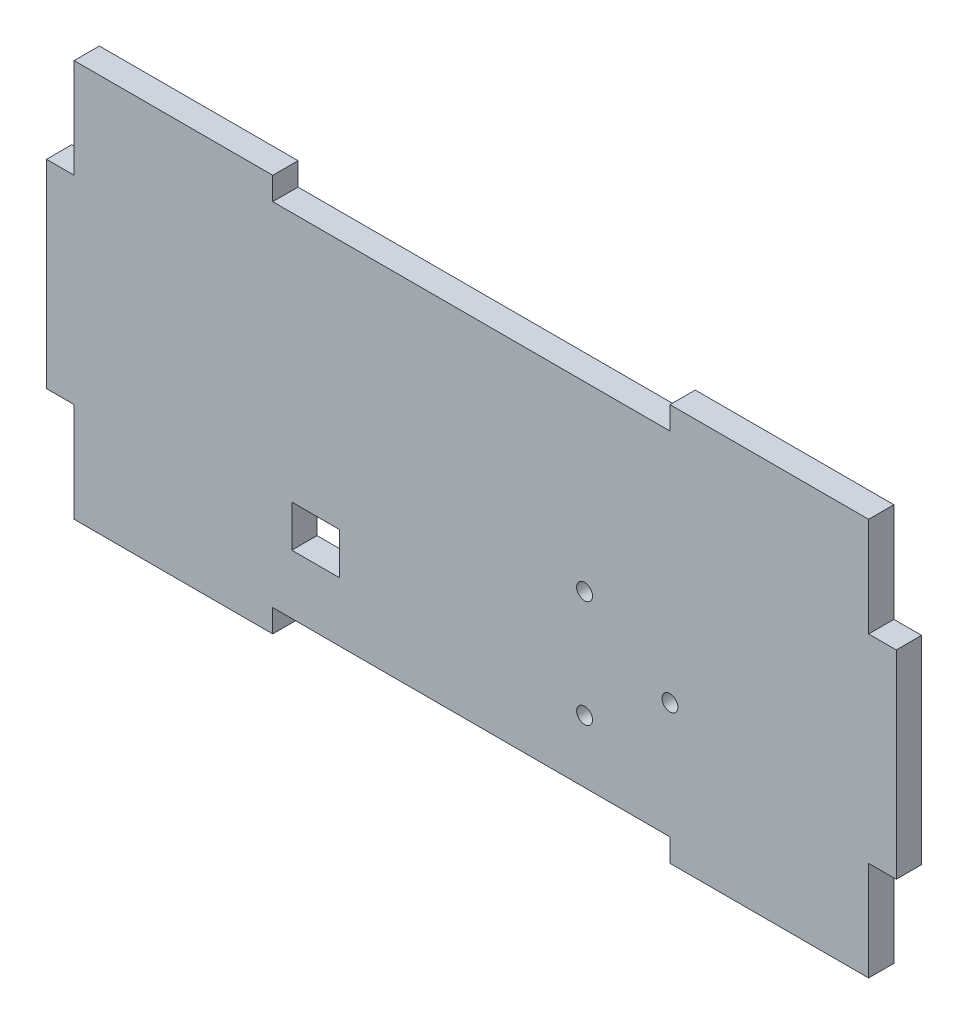
ISO-10303-21;
HEADER;
FILE_DESCRIPTION(('STEP AP214'),'2;1');
FILE_NAME('part.step','',(''),(''),'','','');
FILE_SCHEMA(('AUTOMOTIVE_DESIGN { 1 0 10303 214 1 1 1 1 }'));
ENDSEC;
DATA;
#1=APPLICATION_CONTEXT('core data for automotive mechanical design processes');
#2=APPLICATION_PROTOCOL_DEFINITION('international standard','automotive_design',2000,#1);
#3=PRODUCT_CONTEXT('',#1,'mechanical');
#4=PRODUCT('Part','Part','',(#3));
#5=PRODUCT_RELATED_PRODUCT_CATEGORY('part','',(#4));
#6=PRODUCT_DEFINITION_FORMATION('','',#4);
#7=PRODUCT_DEFINITION_CONTEXT('part definition',#1,'design');
#8=PRODUCT_DEFINITION('design','',#6,#7);
#9=PRODUCT_DEFINITION_SHAPE('','',#8);
#10=(LENGTH_UNIT() NAMED_UNIT(*) SI_UNIT(.MILLI.,.METRE.));
#11=(NAMED_UNIT(*) PLANE_ANGLE_UNIT() SI_UNIT($,.RADIAN.));
#12=(NAMED_UNIT(*) SI_UNIT($,.STERADIAN.) SOLID_ANGLE_UNIT());
#13=UNCERTAINTY_MEASURE_WITH_UNIT(LENGTH_MEASURE(1.E-05),#10,'distance_accuracy_value','');
#14=(GEOMETRIC_REPRESENTATION_CONTEXT(3) GLOBAL_UNCERTAINTY_ASSIGNED_CONTEXT((#13)) GLOBAL_UNIT_ASSIGNED_CONTEXT((#10,
#11,#12)) REPRESENTATION_CONTEXT('',''));
#15=CARTESIAN_POINT('',(0.,0.,0.));
#16=DIRECTION('',(0.,0.,1.));
#17=DIRECTION('',(1.,0.,0.));
#18=AXIS2_PLACEMENT_3D('',#15,#16,#17);
#19=CARTESIAN_POINT('',(0.,0.,6.36));
#20=DIRECTION('',(0.,0.,1.));
#21=DIRECTION('',(1.,0.,0.));
#22=AXIS2_PLACEMENT_3D('',#19,#20,#21);
#23=PLANE('',#22);
#24=CARTESIAN_POINT('',(50.,-15.,6.36));
#25=DIRECTION('',(0.,0.,1.));
#26=DIRECTION('',(1.,0.,0.));
#27=AXIS2_PLACEMENT_3D('',#24,#25,#26);
#28=CIRCLE('',#27,2.);
#29=CARTESIAN_POINT('',(52.,-15.,6.36));
#30=VERTEX_POINT('',#29);
#31=EDGE_CURVE('E236',#30,#30,#28,.T.);
#32=ORIENTED_EDGE('',*,*,#31,.F.);
#33=EDGE_LOOP('',(#32));
#34=FACE_BOUND('',#33,.T.);
#35=CARTESIAN_POINT('',(28.5,-1.50000000000001,6.36));
#36=DIRECTION('',(0.,0.,1.));
#37=DIRECTION('',(1.,0.,0.));
#38=AXIS2_PLACEMENT_3D('',#35,#36,#37);
#39=CIRCLE('',#38,2.);
#40=CARTESIAN_POINT('',(30.5,-1.50000000000001,6.36));
#41=VERTEX_POINT('',#40);
#42=EDGE_CURVE('E240',#41,#41,#39,.T.);
#43=ORIENTED_EDGE('',*,*,#42,.F.);
#44=EDGE_LOOP('',(#43));
#45=FACE_BOUND('',#44,.T.);
#46=CARTESIAN_POINT('',(28.5,-28.5,6.36));
#47=DIRECTION('',(0.,0.,1.));
#48=DIRECTION('',(-1.,0.,0.));
#49=AXIS2_PLACEMENT_3D('',#46,#47,#48);
#50=CIRCLE('',#49,2.00000000000001);
#51=CARTESIAN_POINT('',(26.5,-28.5,6.36));
#52=VERTEX_POINT('',#51);
#53=EDGE_CURVE('E232',#52,#52,#50,.T.);
#54=ORIENTED_EDGE('',*,*,#53,.F.);
#55=EDGE_LOOP('',(#54));
#56=FACE_BOUND('',#55,.T.);
#57=DIRECTION('',(1.,0.,0.));
#58=VECTOR('',#57,1.);
#59=CARTESIAN_POINT('',(-100.,-50.,6.36));
#60=LINE('',#59,#58);
#61=CARTESIAN_POINT('',(-100.,-50.,6.36));
#62=VERTEX_POINT('',#61);
#63=CARTESIAN_POINT('',(-50.,-50.,6.36));
#64=VERTEX_POINT('',#63);
#65=EDGE_CURVE('E362',#62,#64,#60,.T.);
#66=ORIENTED_EDGE('',*,*,#65,.T.);
#67=DIRECTION('',(0.,1.,0.));
#68=VECTOR('',#67,1.);
#69=CARTESIAN_POINT('',(-50.,0.,6.36));
#70=LINE('',#69,#68);
#71=CARTESIAN_POINT('',(-50.,-44.24,6.36));
#72=VERTEX_POINT('',#71);
#73=EDGE_CURVE('E269',#64,#72,#70,.T.);
#74=ORIENTED_EDGE('',*,*,#73,.T.);
#75=DIRECTION('',(1.,0.,0.));
#76=VECTOR('',#75,1.);
#77=CARTESIAN_POINT('',(0.,-44.24,6.36));
#78=LINE('',#77,#76);
#79=CARTESIAN_POINT('',(50.,-44.24,6.36));
#80=VERTEX_POINT('',#79);
#81=EDGE_CURVE('E266',#72,#80,#78,.T.);
#82=ORIENTED_EDGE('',*,*,#81,.T.);
#83=DIRECTION('',(0.,-1.,0.));
#84=VECTOR('',#83,1.);
#85=CARTESIAN_POINT('',(50.,0.,6.36));
#86=LINE('',#85,#84);
#87=CARTESIAN_POINT('',(50.,-50.,6.36));
#88=VERTEX_POINT('',#87);
#89=EDGE_CURVE('E256',#80,#88,#86,.T.);
#90=ORIENTED_EDGE('',*,*,#89,.T.);
#91=CARTESIAN_POINT('',(100.,-50.,6.36));
#92=VERTEX_POINT('',#91);
#93=EDGE_CURVE('E361',#88,#92,#60,.T.);
#94=ORIENTED_EDGE('',*,*,#93,.T.);
#95=DIRECTION('',(0.,1.,0.));
#96=VECTOR('',#95,1.);
#97=CARTESIAN_POINT('',(100.,50.,6.36));
#98=LINE('',#97,#96);
#99=CARTESIAN_POINT('',(100.,-25.,6.36));
#100=VERTEX_POINT('',#99);
#101=EDGE_CURVE('E349',#92,#100,#98,.T.);
#102=ORIENTED_EDGE('',*,*,#101,.T.);
#103=DIRECTION('',(1.,0.,0.));
#104=VECTOR('',#103,1.);
#105=CARTESIAN_POINT('',(100.,-25.,6.36));
#106=LINE('',#105,#104);
#107=CARTESIAN_POINT('',(106.96,-25.,6.36));
#108=VERTEX_POINT('',#107);
#109=EDGE_CURVE('E304',#100,#108,#106,.T.);
#110=ORIENTED_EDGE('',*,*,#109,.T.);
#111=DIRECTION('',(0.,1.,0.));
#112=VECTOR('',#111,1.);
#113=CARTESIAN_POINT('',(106.96,25.,6.36));
#114=LINE('',#113,#112);
#115=CARTESIAN_POINT('',(106.96,25.,6.36));
#116=VERTEX_POINT('',#115);
#117=EDGE_CURVE('E301',#108,#116,#114,.T.);
#118=ORIENTED_EDGE('',*,*,#117,.T.);
#119=DIRECTION('',(-1.,0.,0.));
#120=VECTOR('',#119,1.);
#121=CARTESIAN_POINT('',(100.,25.,6.36));
#122=LINE('',#121,#120);
#123=CARTESIAN_POINT('',(100.,25.,6.36));
#124=VERTEX_POINT('',#123);
#125=EDGE_CURVE('E299',#116,#124,#122,.T.);
#126=ORIENTED_EDGE('',*,*,#125,.T.);
#127=CARTESIAN_POINT('',(100.,50.,6.36));
#128=VERTEX_POINT('',#127);
#129=EDGE_CURVE('E353',#124,#128,#98,.T.);
#130=ORIENTED_EDGE('',*,*,#129,.T.);
#131=DIRECTION('',(-1.,0.,0.));
#132=VECTOR('',#131,1.);
#133=CARTESIAN_POINT('',(-100.,50.,6.36));
#134=LINE('',#133,#132);
#135=CARTESIAN_POINT('',(50.,50.,6.36));
#136=VERTEX_POINT('',#135);
#137=EDGE_CURVE('E354',#128,#136,#134,.T.);
#138=ORIENTED_EDGE('',*,*,#137,.T.);
#139=DIRECTION('',(0.,1.,0.));
#140=VECTOR('',#139,1.);
#141=CARTESIAN_POINT('',(50.,0.,6.36));
#142=LINE('',#141,#140);
#143=CARTESIAN_POINT('',(50.,44.24,6.36));
#144=VERTEX_POINT('',#143);
#145=EDGE_CURVE('E294',#144,#136,#142,.T.);
#146=ORIENTED_EDGE('',*,*,#145,.F.);
#147=DIRECTION('',(1.,0.,0.));
#148=VECTOR('',#147,1.);
#149=CARTESIAN_POINT('',(0.,44.24,6.36));
#150=LINE('',#149,#148);
#151=CARTESIAN_POINT('',(-50.,44.24,6.36));
#152=VERTEX_POINT('',#151);
#153=EDGE_CURVE('E284',#152,#144,#150,.T.);
#154=ORIENTED_EDGE('',*,*,#153,.F.);
#155=DIRECTION('',(0.,-1.,0.));
#156=VECTOR('',#155,1.);
#157=CARTESIAN_POINT('',(-50.,0.,6.36));
#158=LINE('',#157,#156);
#159=CARTESIAN_POINT('',(-50.,50.,6.36));
#160=VERTEX_POINT('',#159);
#161=EDGE_CURVE('E296',#160,#152,#158,.T.);
#162=ORIENTED_EDGE('',*,*,#161,.F.);
#163=CARTESIAN_POINT('',(-100.,50.,6.36));
#164=VERTEX_POINT('',#163);
#165=EDGE_CURVE('E352',#160,#164,#134,.T.);
#166=ORIENTED_EDGE('',*,*,#165,.T.);
#167=DIRECTION('',(0.,-1.,0.));
#168=VECTOR('',#167,1.);
#169=CARTESIAN_POINT('',(-100.,50.,6.36));
#170=LINE('',#169,#168);
#171=CARTESIAN_POINT('',(-100.,25.,6.36));
#172=VERTEX_POINT('',#171);
#173=EDGE_CURVE('E358',#164,#172,#170,.T.);
#174=ORIENTED_EDGE('',*,*,#173,.T.);
#175=DIRECTION('',(1.,0.,0.));
#176=VECTOR('',#175,1.);
#177=CARTESIAN_POINT('',(-100.,25.,6.36));
#178=LINE('',#177,#176);
#179=CARTESIAN_POINT('',(-106.96,25.,6.36));
#180=VERTEX_POINT('',#179);
#181=EDGE_CURVE('E330',#180,#172,#178,.T.);
#182=ORIENTED_EDGE('',*,*,#181,.F.);
#183=DIRECTION('',(0.,1.,0.));
#184=VECTOR('',#183,1.);
#185=CARTESIAN_POINT('',(-106.96,25.,6.36));
#186=LINE('',#185,#184);
#187=CARTESIAN_POINT('',(-106.96,-25.,6.36));
#188=VERTEX_POINT('',#187);
#189=EDGE_CURVE('E326',#188,#180,#186,.T.);
#190=ORIENTED_EDGE('',*,*,#189,.F.);
#191=DIRECTION('',(-1.,0.,0.));
#192=VECTOR('',#191,1.);
#193=CARTESIAN_POINT('',(-100.,-25.,6.36));
#194=LINE('',#193,#192);
#195=CARTESIAN_POINT('',(-100.,-25.,6.36));
#196=VERTEX_POINT('',#195);
#197=EDGE_CURVE('E323',#196,#188,#194,.T.);
#198=ORIENTED_EDGE('',*,*,#197,.F.);
#199=EDGE_CURVE('E357',#196,#62,#170,.T.);
#200=ORIENTED_EDGE('',*,*,#199,.T.);
#201=EDGE_LOOP('',(#66,#74,#82,#90,#94,#102,#110,#118,#126,#130,#138,#146,#154,#162,#166,#174,
#182,#190,#198,#200));
#202=FACE_BOUND('',#201,.T.);
#203=DIRECTION('',(-1.,0.,0.));
#204=VECTOR('',#203,1.);
#205=CARTESIAN_POINT('',(0.,-18.84,6.36));
#206=LINE('',#205,#204);
#207=CARTESIAN_POINT('',(-33.1999999999999,-18.84,6.36));
#208=VERTEX_POINT('',#207);
#209=CARTESIAN_POINT('',(-45.1999999999999,-18.84,6.36));
#210=VERTEX_POINT('',#209);
#211=EDGE_CURVE('E214',#208,#210,#206,.T.);
#212=ORIENTED_EDGE('',*,*,#211,.F.);
#213=DIRECTION('',(0.,1.,0.));
#214=VECTOR('',#213,1.);
#215=CARTESIAN_POINT('',(-33.1999999999999,0.,6.36));
#216=LINE('',#215,#214);
#217=CARTESIAN_POINT('',(-33.1999999999999,-29.34,6.36));
#218=VERTEX_POINT('',#217);
#219=EDGE_CURVE('E210',#218,#208,#216,.T.);
#220=ORIENTED_EDGE('',*,*,#219,.F.);
#221=DIRECTION('',(1.,0.,0.));
#222=VECTOR('',#221,1.);
#223=CARTESIAN_POINT('',(0.,-29.34,6.36));
#224=LINE('',#223,#222);
#225=CARTESIAN_POINT('',(-45.1999999999999,-29.34,6.36));
#226=VERTEX_POINT('',#225);
#227=EDGE_CURVE('E202',#226,#218,#224,.T.);
#228=ORIENTED_EDGE('',*,*,#227,.F.);
#229=DIRECTION('',(0.,-1.,0.));
#230=VECTOR('',#229,1.);
#231=CARTESIAN_POINT('',(-45.1999999999999,0.,6.36));
#232=LINE('',#231,#230);
#233=EDGE_CURVE('E209',#210,#226,#232,.T.);
#234=ORIENTED_EDGE('',*,*,#233,.F.);
#235=EDGE_LOOP('',(#212,#220,#228,#234));
#236=FACE_BOUND('',#235,.T.);
#237=ADVANCED_FACE('F39',(#34,#45,#56,#202,#236),#23,.T.);
#238=CARTESIAN_POINT('',(0.,0.,0.));
#239=DIRECTION('',(0.,0.,1.));
#240=DIRECTION('',(1.,0.,0.));
#241=AXIS2_PLACEMENT_3D('',#238,#239,#240);
#242=PLANE('',#241);
#243=DIRECTION('',(0.,1.,0.));
#244=VECTOR('',#243,1.);
#245=CARTESIAN_POINT('',(-50.,-50.,0.));
#246=LINE('',#245,#244);
#247=CARTESIAN_POINT('',(-50.,-50.,0.));
#248=VERTEX_POINT('',#247);
#249=CARTESIAN_POINT('',(-50.,-44.24,0.));
#250=VERTEX_POINT('',#249);
#251=EDGE_CURVE('E245',#248,#250,#246,.T.);
#252=ORIENTED_EDGE('',*,*,#251,.F.);
#253=DIRECTION('',(1.,0.,0.));
#254=VECTOR('',#253,1.);
#255=CARTESIAN_POINT('',(-100.,-50.,0.));
#256=LINE('',#255,#254);
#257=CARTESIAN_POINT('',(-100.,-50.,0.));
#258=VERTEX_POINT('',#257);
#259=EDGE_CURVE('E378',#258,#248,#256,.T.);
#260=ORIENTED_EDGE('',*,*,#259,.F.);
#261=DIRECTION('',(0.,-1.,0.));
#262=VECTOR('',#261,1.);
#263=CARTESIAN_POINT('',(-100.,50.,0.));
#264=LINE('',#263,#262);
#265=CARTESIAN_POINT('',(-100.,-25.,0.));
#266=VERTEX_POINT('',#265);
#267=EDGE_CURVE('E373',#266,#258,#264,.T.);
#268=ORIENTED_EDGE('',*,*,#267,.F.);
#269=DIRECTION('',(-1.,0.,0.));
#270=VECTOR('',#269,1.);
#271=CARTESIAN_POINT('',(-100.,-25.,0.));
#272=LINE('',#271,#270);
#273=CARTESIAN_POINT('',(-106.96,-25.,0.));
#274=VERTEX_POINT('',#273);
#275=EDGE_CURVE('E314',#266,#274,#272,.T.);
#276=ORIENTED_EDGE('',*,*,#275,.T.);
#277=DIRECTION('',(0.,1.,0.));
#278=VECTOR('',#277,1.);
#279=CARTESIAN_POINT('',(-106.96,25.,0.));
#280=LINE('',#279,#278);
#281=CARTESIAN_POINT('',(-106.96,25.,0.));
#282=VERTEX_POINT('',#281);
#283=EDGE_CURVE('E335',#274,#282,#280,.T.);
#284=ORIENTED_EDGE('',*,*,#283,.T.);
#285=DIRECTION('',(1.,0.,0.));
#286=VECTOR('',#285,1.);
#287=CARTESIAN_POINT('',(-100.,25.,0.));
#288=LINE('',#287,#286);
#289=CARTESIAN_POINT('',(-100.,25.,0.));
#290=VERTEX_POINT('',#289);
#291=EDGE_CURVE('E327',#282,#290,#288,.T.);
#292=ORIENTED_EDGE('',*,*,#291,.T.);
#293=CARTESIAN_POINT('',(-100.,50.,0.));
#294=VERTEX_POINT('',#293);
#295=EDGE_CURVE('E374',#294,#290,#264,.T.);
#296=ORIENTED_EDGE('',*,*,#295,.F.);
#297=DIRECTION('',(-1.,0.,0.));
#298=VECTOR('',#297,1.);
#299=CARTESIAN_POINT('',(-100.,50.,0.));
#300=LINE('',#299,#298);
#301=CARTESIAN_POINT('',(-50.,50.,0.));
#302=VERTEX_POINT('',#301);
#303=EDGE_CURVE('E369',#302,#294,#300,.T.);
#304=ORIENTED_EDGE('',*,*,#303,.F.);
#305=DIRECTION('',(0.,-1.,0.));
#306=VECTOR('',#305,1.);
#307=CARTESIAN_POINT('',(-50.,50.,0.));
#308=LINE('',#307,#306);
#309=CARTESIAN_POINT('',(-50.,44.24,0.));
#310=VERTEX_POINT('',#309);
#311=EDGE_CURVE('E272',#302,#310,#308,.T.);
#312=ORIENTED_EDGE('',*,*,#311,.T.);
#313=DIRECTION('',(1.,0.,0.));
#314=VECTOR('',#313,1.);
#315=CARTESIAN_POINT('',(-50.,44.24,0.));
#316=LINE('',#315,#314);
#317=CARTESIAN_POINT('',(50.,44.24,0.));
#318=VERTEX_POINT('',#317);
#319=EDGE_CURVE('E275',#310,#318,#316,.T.);
#320=ORIENTED_EDGE('',*,*,#319,.T.);
#321=DIRECTION('',(0.,1.,0.));
#322=VECTOR('',#321,1.);
#323=CARTESIAN_POINT('',(50.,50.,0.));
#324=LINE('',#323,#322);
#325=CARTESIAN_POINT('',(50.,50.,0.));
#326=VERTEX_POINT('',#325);
#327=EDGE_CURVE('E278',#318,#326,#324,.T.);
#328=ORIENTED_EDGE('',*,*,#327,.T.);
#329=CARTESIAN_POINT('',(100.,50.,0.));
#330=VERTEX_POINT('',#329);
#331=EDGE_CURVE('E370',#330,#326,#300,.T.);
#332=ORIENTED_EDGE('',*,*,#331,.F.);
#333=DIRECTION('',(0.,1.,0.));
#334=VECTOR('',#333,1.);
#335=CARTESIAN_POINT('',(100.,50.,0.));
#336=LINE('',#335,#334);
#337=CARTESIAN_POINT('',(100.,25.,0.));
#338=VERTEX_POINT('',#337);
#339=EDGE_CURVE('E342',#338,#330,#336,.T.);
#340=ORIENTED_EDGE('',*,*,#339,.F.);
#341=DIRECTION('',(-1.,0.,0.));
#342=VECTOR('',#341,1.);
#343=CARTESIAN_POINT('',(100.,25.,0.));
#344=LINE('',#343,#342);
#345=CARTESIAN_POINT('',(106.96,25.,0.));
#346=VERTEX_POINT('',#345);
#347=EDGE_CURVE('E298',#346,#338,#344,.T.);
#348=ORIENTED_EDGE('',*,*,#347,.F.);
#349=DIRECTION('',(0.,1.,0.));
#350=VECTOR('',#349,1.);
#351=CARTESIAN_POINT('',(106.96,25.,0.));
#352=LINE('',#351,#350);
#353=CARTESIAN_POINT('',(106.96,-25.,0.));
#354=VERTEX_POINT('',#353);
#355=EDGE_CURVE('E308',#354,#346,#352,.T.);
#356=ORIENTED_EDGE('',*,*,#355,.F.);
#357=DIRECTION('',(1.,0.,0.));
#358=VECTOR('',#357,1.);
#359=CARTESIAN_POINT('',(100.,-25.,0.));
#360=LINE('',#359,#358);
#361=CARTESIAN_POINT('',(100.,-25.,0.));
#362=VERTEX_POINT('',#361);
#363=EDGE_CURVE('E302',#362,#354,#360,.T.);
#364=ORIENTED_EDGE('',*,*,#363,.F.);
#365=CARTESIAN_POINT('',(100.,-50.,0.));
#366=VERTEX_POINT('',#365);
#367=EDGE_CURVE('E366',#366,#362,#336,.T.);
#368=ORIENTED_EDGE('',*,*,#367,.F.);
#369=CARTESIAN_POINT('',(50.,-50.,0.));
#370=VERTEX_POINT('',#369);
#371=EDGE_CURVE('E377',#370,#366,#256,.T.);
#372=ORIENTED_EDGE('',*,*,#371,.F.);
#373=DIRECTION('',(0.,-1.,0.));
#374=VECTOR('',#373,1.);
#375=CARTESIAN_POINT('',(50.,-50.,0.));
#376=LINE('',#375,#374);
#377=CARTESIAN_POINT('',(50.,-44.24,0.));
#378=VERTEX_POINT('',#377);
#379=EDGE_CURVE('E247',#378,#370,#376,.T.);
#380=ORIENTED_EDGE('',*,*,#379,.F.);
#381=DIRECTION('',(1.,0.,0.));
#382=VECTOR('',#381,1.);
#383=CARTESIAN_POINT('',(-50.,-44.24,0.));
#384=LINE('',#383,#382);
#385=EDGE_CURVE('E249',#250,#378,#384,.T.);
#386=ORIENTED_EDGE('',*,*,#385,.F.);
#387=EDGE_LOOP('',(#252,#260,#268,#276,#284,#292,#296,#304,#312,#320,#328,#332,#340,#348,#356,
#364,#368,#372,#380,#386));
#388=FACE_BOUND('',#387,.T.);
#389=CARTESIAN_POINT('',(28.5,-28.5,0.));
#390=DIRECTION('',(0.,0.,1.));
#391=DIRECTION('',(1.,0.,0.));
#392=AXIS2_PLACEMENT_3D('',#389,#390,#391);
#393=CIRCLE('',#392,2.00000000000001);
#394=CARTESIAN_POINT('',(30.5,-28.5,0.));
#395=VERTEX_POINT('',#394);
#396=EDGE_CURVE('E239',#395,#395,#393,.T.);
#397=ORIENTED_EDGE('',*,*,#396,.T.);
#398=EDGE_LOOP('',(#397));
#399=FACE_BOUND('',#398,.T.);
#400=CARTESIAN_POINT('',(28.5,-1.50000000000001,0.));
#401=DIRECTION('',(0.,0.,1.));
#402=DIRECTION('',(1.,0.,0.));
#403=AXIS2_PLACEMENT_3D('',#400,#401,#402);
#404=CIRCLE('',#403,2.);
#405=CARTESIAN_POINT('',(30.5,-1.50000000000001,0.));
#406=VERTEX_POINT('',#405);
#407=EDGE_CURVE('E389',#406,#406,#404,.T.);
#408=ORIENTED_EDGE('',*,*,#407,.T.);
#409=EDGE_LOOP('',(#408));
#410=FACE_BOUND('',#409,.T.);
#411=CARTESIAN_POINT('',(50.,-15.,0.));
#412=DIRECTION('',(0.,0.,1.));
#413=DIRECTION('',(1.,0.,0.));
#414=AXIS2_PLACEMENT_3D('',#411,#412,#413);
#415=CIRCLE('',#414,2.);
#416=CARTESIAN_POINT('',(52.,-15.,0.));
#417=VERTEX_POINT('',#416);
#418=EDGE_CURVE('E43',#417,#417,#415,.T.);
#419=ORIENTED_EDGE('',*,*,#418,.T.);
#420=EDGE_LOOP('',(#419));
#421=FACE_BOUND('',#420,.T.);
#422=DIRECTION('',(0.,1.,0.));
#423=VECTOR('',#422,1.);
#424=CARTESIAN_POINT('',(-33.1999999999999,0.,0.));
#425=LINE('',#424,#423);
#426=CARTESIAN_POINT('',(-33.1999999999999,-29.34,0.));
#427=VERTEX_POINT('',#426);
#428=CARTESIAN_POINT('',(-33.1999999999999,-18.84,0.));
#429=VERTEX_POINT('',#428);
#430=EDGE_CURVE('E64',#427,#429,#425,.T.);
#431=ORIENTED_EDGE('',*,*,#430,.T.);
#432=DIRECTION('',(-1.,0.,0.));
#433=VECTOR('',#432,1.);
#434=CARTESIAN_POINT('',(0.,-18.84,0.));
#435=LINE('',#434,#433);
#436=CARTESIAN_POINT('',(-45.1999999999999,-18.84,0.));
#437=VERTEX_POINT('',#436);
#438=EDGE_CURVE('E217',#429,#437,#435,.T.);
#439=ORIENTED_EDGE('',*,*,#438,.T.);
#440=DIRECTION('',(0.,-1.,0.));
#441=VECTOR('',#440,1.);
#442=CARTESIAN_POINT('',(-45.1999999999999,0.,0.));
#443=LINE('',#442,#441);
#444=CARTESIAN_POINT('',(-45.1999999999999,-29.34,0.));
#445=VERTEX_POINT('',#444);
#446=EDGE_CURVE('E220',#437,#445,#443,.T.);
#447=ORIENTED_EDGE('',*,*,#446,.T.);
#448=DIRECTION('',(1.,0.,0.));
#449=VECTOR('',#448,1.);
#450=CARTESIAN_POINT('',(0.,-29.34,0.));
#451=LINE('',#450,#449);
#452=EDGE_CURVE('E226',#445,#427,#451,.T.);
#453=ORIENTED_EDGE('',*,*,#452,.T.);
#454=EDGE_LOOP('',(#431,#439,#447,#453));
#455=FACE_BOUND('',#454,.T.);
#456=ADVANCED_FACE('F396',(#388,#399,#410,#421,#455),#242,.F.);
#457=CARTESIAN_POINT('',(-100.,-50.,6.36));
#458=DIRECTION('',(0.,1.,0.));
#459=DIRECTION('',(0.,0.,1.));
#460=AXIS2_PLACEMENT_3D('',#457,#458,#459);
#461=PLANE('',#460);
#462=DIRECTION('',(0.,0.,1.));
#463=VECTOR('',#462,1.);
#464=CARTESIAN_POINT('',(-50.,-50.,0.));
#465=LINE('',#464,#463);
#466=EDGE_CURVE('E252',#248,#64,#465,.T.);
#467=ORIENTED_EDGE('',*,*,#466,.T.);
#468=ORIENTED_EDGE('',*,*,#65,.F.);
#469=DIRECTION('',(0.,0.,-1.));
#470=VECTOR('',#469,1.);
#471=CARTESIAN_POINT('',(-100.,-50.,6.36));
#472=LINE('',#471,#470);
#473=EDGE_CURVE('E383',#62,#258,#472,.T.);
#474=ORIENTED_EDGE('',*,*,#473,.T.);
#475=ORIENTED_EDGE('',*,*,#259,.T.);
#476=EDGE_LOOP('',(#467,#468,#474,#475));
#477=FACE_BOUND('',#476,.T.);
#478=ADVANCED_FACE('F419',(#477),#461,.F.);
#479=DIRECTION('',(0.,0.,1.));
#480=VECTOR('',#479,1.);
#481=CARTESIAN_POINT('',(50.,-50.,0.));
#482=LINE('',#481,#480);
#483=EDGE_CURVE('E260',#370,#88,#482,.T.);
#484=ORIENTED_EDGE('',*,*,#483,.F.);
#485=ORIENTED_EDGE('',*,*,#371,.T.);
#486=DIRECTION('',(0.,0.,-1.));
#487=VECTOR('',#486,1.);
#488=CARTESIAN_POINT('',(100.,-50.,6.36));
#489=LINE('',#488,#487);
#490=EDGE_CURVE('E365',#92,#366,#489,.T.);
#491=ORIENTED_EDGE('',*,*,#490,.F.);
#492=ORIENTED_EDGE('',*,*,#93,.F.);
#493=EDGE_LOOP('',(#484,#485,#491,#492));
#494=FACE_BOUND('',#493,.T.);
#495=ADVANCED_FACE('F430',(#494),#461,.F.);
#496=CARTESIAN_POINT('',(-100.,50.,6.36));
#497=DIRECTION('',(0.,-1.,0.));
#498=DIRECTION('',(0.,0.,-1.));
#499=AXIS2_PLACEMENT_3D('',#496,#497,#498);
#500=PLANE('',#499);
#501=ORIENTED_EDGE('',*,*,#165,.F.);
#502=DIRECTION('',(0.,0.,1.));
#503=VECTOR('',#502,1.);
#504=CARTESIAN_POINT('',(-50.,50.,0.));
#505=LINE('',#504,#503);
#506=EDGE_CURVE('E282',#302,#160,#505,.T.);
#507=ORIENTED_EDGE('',*,*,#506,.F.);
#508=ORIENTED_EDGE('',*,*,#303,.T.);
#509=DIRECTION('',(0.,0.,-1.));
#510=VECTOR('',#509,1.);
#511=CARTESIAN_POINT('',(-100.,50.,6.36));
#512=LINE('',#511,#510);
#513=EDGE_CURVE('E48',#164,#294,#512,.T.);
#514=ORIENTED_EDGE('',*,*,#513,.F.);
#515=EDGE_LOOP('',(#501,#507,#508,#514));
#516=FACE_BOUND('',#515,.T.);
#517=ADVANCED_FACE('F440',(#516),#500,.F.);
#518=CARTESIAN_POINT('',(100.,50.,6.36));
#519=DIRECTION('',(-1.,0.,0.));
#520=DIRECTION('',(0.,0.,1.));
#521=AXIS2_PLACEMENT_3D('',#518,#519,#520);
#522=PLANE('',#521);
#523=DIRECTION('',(0.,0.,-1.));
#524=VECTOR('',#523,1.);
#525=CARTESIAN_POINT('',(100.,-25.,6.36));
#526=LINE('',#525,#524);
#527=EDGE_CURVE('E311',#100,#362,#526,.T.);
#528=ORIENTED_EDGE('',*,*,#527,.F.);
#529=ORIENTED_EDGE('',*,*,#101,.F.);
#530=ORIENTED_EDGE('',*,*,#490,.T.);
#531=ORIENTED_EDGE('',*,*,#367,.T.);
#532=EDGE_LOOP('',(#528,#529,#530,#531));
#533=FACE_BOUND('',#532,.T.);
#534=ADVANCED_FACE('F445',(#533),#522,.F.);
#535=CARTESIAN_POINT('',(-100.,50.,6.36));
#536=DIRECTION('',(1.,0.,0.));
#537=DIRECTION('',(0.,1.,0.));
#538=AXIS2_PLACEMENT_3D('',#535,#536,#537);
#539=PLANE('',#538);
#540=DIRECTION('',(0.,0.,-1.));
#541=VECTOR('',#540,1.);
#542=CARTESIAN_POINT('',(-100.,25.,6.36));
#543=LINE('',#542,#541);
#544=EDGE_CURVE('E340',#172,#290,#543,.T.);
#545=ORIENTED_EDGE('',*,*,#544,.F.);
#546=ORIENTED_EDGE('',*,*,#173,.F.);
#547=ORIENTED_EDGE('',*,*,#513,.T.);
#548=ORIENTED_EDGE('',*,*,#295,.T.);
#549=EDGE_LOOP('',(#545,#546,#547,#548));
#550=FACE_BOUND('',#549,.T.);
#551=ADVANCED_FACE('F437',(#550),#539,.F.);
#552=ORIENTED_EDGE('',*,*,#129,.F.);
#553=DIRECTION('',(0.,0.,-1.));
#554=VECTOR('',#553,1.);
#555=CARTESIAN_POINT('',(100.,25.,6.36));
#556=LINE('',#555,#554);
#557=EDGE_CURVE('E306',#124,#338,#556,.T.);
#558=ORIENTED_EDGE('',*,*,#557,.T.);
#559=ORIENTED_EDGE('',*,*,#339,.T.);
#560=DIRECTION('',(0.,0.,-1.));
#561=VECTOR('',#560,1.);
#562=CARTESIAN_POINT('',(100.,50.,6.36));
#563=LINE('',#562,#561);
#564=EDGE_CURVE('E11',#128,#330,#563,.T.);
#565=ORIENTED_EDGE('',*,*,#564,.F.);
#566=EDGE_LOOP('',(#552,#558,#559,#565));
#567=FACE_BOUND('',#566,.T.);
#568=ADVANCED_FACE('F41',(#567),#522,.F.);
#569=ORIENTED_EDGE('',*,*,#331,.T.);
#570=DIRECTION('',(0.,0.,1.));
#571=VECTOR('',#570,1.);
#572=CARTESIAN_POINT('',(50.,50.,0.));
#573=LINE('',#572,#571);
#574=EDGE_CURVE('E285',#326,#136,#573,.T.);
#575=ORIENTED_EDGE('',*,*,#574,.T.);
#576=ORIENTED_EDGE('',*,*,#137,.F.);
#577=ORIENTED_EDGE('',*,*,#564,.T.);
#578=EDGE_LOOP('',(#569,#575,#576,#577));
#579=FACE_BOUND('',#578,.T.);
#580=ADVANCED_FACE('F435',(#579),#500,.F.);
#581=ORIENTED_EDGE('',*,*,#199,.F.);
#582=DIRECTION('',(0.,0.,-1.));
#583=VECTOR('',#582,1.);
#584=CARTESIAN_POINT('',(-100.,-25.,6.36));
#585=LINE('',#584,#583);
#586=EDGE_CURVE('E332',#196,#266,#585,.T.);
#587=ORIENTED_EDGE('',*,*,#586,.T.);
#588=ORIENTED_EDGE('',*,*,#267,.T.);
#589=ORIENTED_EDGE('',*,*,#473,.F.);
#590=EDGE_LOOP('',(#581,#587,#588,#589));
#591=FACE_BOUND('',#590,.T.);
#592=ADVANCED_FACE('F432',(#591),#539,.F.);
#593=CARTESIAN_POINT('',(-100.,25.,6.36));
#594=DIRECTION('',(0.,1.,0.));
#595=DIRECTION('',(0.,0.,1.));
#596=AXIS2_PLACEMENT_3D('',#593,#594,#595);
#597=PLANE('',#596);
#598=ORIENTED_EDGE('',*,*,#291,.F.);
#599=DIRECTION('',(0.,0.,-1.));
#600=VECTOR('',#599,1.);
#601=CARTESIAN_POINT('',(-106.96,25.,6.36));
#602=LINE('',#601,#600);
#603=EDGE_CURVE('E343',#180,#282,#602,.T.);
#604=ORIENTED_EDGE('',*,*,#603,.F.);
#605=ORIENTED_EDGE('',*,*,#181,.T.);
#606=ORIENTED_EDGE('',*,*,#544,.T.);
#607=EDGE_LOOP('',(#598,#604,#605,#606));
#608=FACE_BOUND('',#607,.T.);
#609=ADVANCED_FACE('F434',(#608),#597,.T.);
#610=CARTESIAN_POINT('',(-106.96,25.,6.36));
#611=DIRECTION('',(-1.,0.,0.));
#612=DIRECTION('',(0.,0.,1.));
#613=AXIS2_PLACEMENT_3D('',#610,#611,#612);
#614=PLANE('',#613);
#615=ORIENTED_EDGE('',*,*,#283,.F.);
#616=DIRECTION('',(0.,0.,-1.));
#617=VECTOR('',#616,1.);
#618=CARTESIAN_POINT('',(-106.96,-25.,6.36));
#619=LINE('',#618,#617);
#620=EDGE_CURVE('E345',#188,#274,#619,.T.);
#621=ORIENTED_EDGE('',*,*,#620,.F.);
#622=ORIENTED_EDGE('',*,*,#189,.T.);
#623=ORIENTED_EDGE('',*,*,#603,.T.);
#624=EDGE_LOOP('',(#615,#621,#622,#623));
#625=FACE_BOUND('',#624,.T.);
#626=ADVANCED_FACE('F480',(#625),#614,.T.);
#627=CARTESIAN_POINT('',(-100.,-25.,6.36));
#628=DIRECTION('',(0.,-1.,0.));
#629=DIRECTION('',(1.,0.,0.));
#630=AXIS2_PLACEMENT_3D('',#627,#628,#629);
#631=PLANE('',#630);
#632=ORIENTED_EDGE('',*,*,#275,.F.);
#633=ORIENTED_EDGE('',*,*,#586,.F.);
#634=ORIENTED_EDGE('',*,*,#197,.T.);
#635=ORIENTED_EDGE('',*,*,#620,.T.);
#636=EDGE_LOOP('',(#632,#633,#634,#635));
#637=FACE_BOUND('',#636,.T.);
#638=ADVANCED_FACE('F425',(#637),#631,.T.);
#639=CARTESIAN_POINT('',(100.,-25.,6.36));
#640=DIRECTION('',(0.,1.,0.));
#641=DIRECTION('',(-1.,0.,0.));
#642=AXIS2_PLACEMENT_3D('',#639,#640,#641);
#643=PLANE('',#642);
#644=ORIENTED_EDGE('',*,*,#363,.T.);
#645=DIRECTION('',(0.,0.,-1.));
#646=VECTOR('',#645,1.);
#647=CARTESIAN_POINT('',(106.96,-25.,6.36));
#648=LINE('',#647,#646);
#649=EDGE_CURVE('E315',#108,#354,#648,.T.);
#650=ORIENTED_EDGE('',*,*,#649,.F.);
#651=ORIENTED_EDGE('',*,*,#109,.F.);
#652=ORIENTED_EDGE('',*,*,#527,.T.);
#653=EDGE_LOOP('',(#644,#650,#651,#652));
#654=FACE_BOUND('',#653,.T.);
#655=ADVANCED_FACE('F506',(#654),#643,.F.);
#656=CARTESIAN_POINT('',(106.96,25.,6.36));
#657=DIRECTION('',(-1.,0.,0.));
#658=DIRECTION('',(0.,0.,1.));
#659=AXIS2_PLACEMENT_3D('',#656,#657,#658);
#660=PLANE('',#659);
#661=ORIENTED_EDGE('',*,*,#355,.T.);
#662=DIRECTION('',(0.,0.,-1.));
#663=VECTOR('',#662,1.);
#664=CARTESIAN_POINT('',(106.96,25.,6.36));
#665=LINE('',#664,#663);
#666=EDGE_CURVE('E318',#116,#346,#665,.T.);
#667=ORIENTED_EDGE('',*,*,#666,.F.);
#668=ORIENTED_EDGE('',*,*,#117,.F.);
#669=ORIENTED_EDGE('',*,*,#649,.T.);
#670=EDGE_LOOP('',(#661,#667,#668,#669));
#671=FACE_BOUND('',#670,.T.);
#672=ADVANCED_FACE('F511',(#671),#660,.F.);
#673=CARTESIAN_POINT('',(100.,25.,6.36));
#674=DIRECTION('',(0.,-1.,0.));
#675=DIRECTION('',(0.,0.,-1.));
#676=AXIS2_PLACEMENT_3D('',#673,#674,#675);
#677=PLANE('',#676);
#678=ORIENTED_EDGE('',*,*,#347,.T.);
#679=ORIENTED_EDGE('',*,*,#557,.F.);
#680=ORIENTED_EDGE('',*,*,#125,.F.);
#681=ORIENTED_EDGE('',*,*,#666,.T.);
#682=EDGE_LOOP('',(#678,#679,#680,#681));
#683=FACE_BOUND('',#682,.T.);
#684=ADVANCED_FACE('F517',(#683),#677,.F.);
#685=CARTESIAN_POINT('',(-50.,50.,0.));
#686=DIRECTION('',(-1.,0.,0.));
#687=DIRECTION('',(0.,0.,1.));
#688=AXIS2_PLACEMENT_3D('',#685,#686,#687);
#689=PLANE('',#688);
#690=ORIENTED_EDGE('',*,*,#161,.T.);
#691=DIRECTION('',(0.,0.,1.));
#692=VECTOR('',#691,1.);
#693=CARTESIAN_POINT('',(-50.,44.24,0.));
#694=LINE('',#693,#692);
#695=EDGE_CURVE('E281',#310,#152,#694,.T.);
#696=ORIENTED_EDGE('',*,*,#695,.F.);
#697=ORIENTED_EDGE('',*,*,#311,.F.);
#698=ORIENTED_EDGE('',*,*,#506,.T.);
#699=EDGE_LOOP('',(#690,#696,#697,#698));
#700=FACE_BOUND('',#699,.T.);
#701=ADVANCED_FACE('F465',(#700),#689,.F.);
#702=CARTESIAN_POINT('',(50.,50.,0.));
#703=DIRECTION('',(1.,0.,0.));
#704=DIRECTION('',(0.,0.,-1.));
#705=AXIS2_PLACEMENT_3D('',#702,#703,#704);
#706=PLANE('',#705);
#707=ORIENTED_EDGE('',*,*,#145,.T.);
#708=ORIENTED_EDGE('',*,*,#574,.F.);
#709=ORIENTED_EDGE('',*,*,#327,.F.);
#710=DIRECTION('',(0.,0.,1.));
#711=VECTOR('',#710,1.);
#712=CARTESIAN_POINT('',(50.,44.24,0.));
#713=LINE('',#712,#711);
#714=EDGE_CURVE('E288',#318,#144,#713,.T.);
#715=ORIENTED_EDGE('',*,*,#714,.T.);
#716=EDGE_LOOP('',(#707,#708,#709,#715));
#717=FACE_BOUND('',#716,.T.);
#718=ADVANCED_FACE('F523',(#717),#706,.F.);
#719=CARTESIAN_POINT('',(-50.,44.24,0.));
#720=DIRECTION('',(0.,-1.,0.));
#721=DIRECTION('',(1.,0.,0.));
#722=AXIS2_PLACEMENT_3D('',#719,#720,#721);
#723=PLANE('',#722);
#724=ORIENTED_EDGE('',*,*,#153,.T.);
#725=ORIENTED_EDGE('',*,*,#714,.F.);
#726=ORIENTED_EDGE('',*,*,#319,.F.);
#727=ORIENTED_EDGE('',*,*,#695,.T.);
#728=EDGE_LOOP('',(#724,#725,#726,#727));
#729=FACE_BOUND('',#728,.T.);
#730=ADVANCED_FACE('F468',(#729),#723,.F.);
#731=CARTESIAN_POINT('',(-50.,-50.,0.));
#732=DIRECTION('',(1.,0.,0.));
#733=DIRECTION('',(0.,0.,-1.));
#734=AXIS2_PLACEMENT_3D('',#731,#732,#733);
#735=PLANE('',#734);
#736=ORIENTED_EDGE('',*,*,#466,.F.);
#737=ORIENTED_EDGE('',*,*,#251,.T.);
#738=DIRECTION('',(0.,0.,1.));
#739=VECTOR('',#738,1.);
#740=CARTESIAN_POINT('',(-50.,-44.24,0.));
#741=LINE('',#740,#739);
#742=EDGE_CURVE('E253',#250,#72,#741,.T.);
#743=ORIENTED_EDGE('',*,*,#742,.T.);
#744=ORIENTED_EDGE('',*,*,#73,.F.);
#745=EDGE_LOOP('',(#736,#737,#743,#744));
#746=FACE_BOUND('',#745,.T.);
#747=ADVANCED_FACE('F490',(#746),#735,.T.);
#748=CARTESIAN_POINT('',(-50.,-44.24,0.));
#749=DIRECTION('',(0.,-1.,0.));
#750=DIRECTION('',(1.,0.,0.));
#751=AXIS2_PLACEMENT_3D('',#748,#749,#750);
#752=PLANE('',#751);
#753=ORIENTED_EDGE('',*,*,#742,.F.);
#754=ORIENTED_EDGE('',*,*,#385,.T.);
#755=DIRECTION('',(0.,0.,1.));
#756=VECTOR('',#755,1.);
#757=CARTESIAN_POINT('',(50.,-44.24,0.));
#758=LINE('',#757,#756);
#759=EDGE_CURVE('E257',#378,#80,#758,.T.);
#760=ORIENTED_EDGE('',*,*,#759,.T.);
#761=ORIENTED_EDGE('',*,*,#81,.F.);
#762=EDGE_LOOP('',(#753,#754,#760,#761));
#763=FACE_BOUND('',#762,.T.);
#764=ADVANCED_FACE('F493',(#763),#752,.T.);
#765=CARTESIAN_POINT('',(50.,-50.,0.));
#766=DIRECTION('',(-1.,0.,0.));
#767=DIRECTION('',(0.,0.,1.));
#768=AXIS2_PLACEMENT_3D('',#765,#766,#767);
#769=PLANE('',#768);
#770=ORIENTED_EDGE('',*,*,#759,.F.);
#771=ORIENTED_EDGE('',*,*,#379,.T.);
#772=ORIENTED_EDGE('',*,*,#483,.T.);
#773=ORIENTED_EDGE('',*,*,#89,.F.);
#774=EDGE_LOOP('',(#770,#771,#772,#773));
#775=FACE_BOUND('',#774,.T.);
#776=ADVANCED_FACE('F499',(#775),#769,.T.);
#777=CARTESIAN_POINT('',(28.5,-28.5,-3.64));
#778=DIRECTION('',(0.,0.,1.));
#779=DIRECTION('',(1.,0.,0.));
#780=AXIS2_PLACEMENT_3D('',#777,#778,#779);
#781=CYLINDRICAL_SURFACE('',#780,2.00000000000001);
#782=ORIENTED_EDGE('',*,*,#53,.T.);
#783=EDGE_LOOP('',(#782));
#784=FACE_BOUND('',#783,.T.);
#785=ORIENTED_EDGE('',*,*,#396,.F.);
#786=EDGE_LOOP('',(#785));
#787=FACE_BOUND('',#786,.T.);
#788=ADVANCED_FACE('F410',(#784,#787),#781,.F.);
#789=CARTESIAN_POINT('',(28.5,-1.50000000000001,-3.64));
#790=DIRECTION('',(0.,0.,1.));
#791=DIRECTION('',(1.,0.,0.));
#792=AXIS2_PLACEMENT_3D('',#789,#790,#791);
#793=CYLINDRICAL_SURFACE('',#792,2.);
#794=ORIENTED_EDGE('',*,*,#42,.T.);
#795=EDGE_LOOP('',(#794));
#796=FACE_BOUND('',#795,.T.);
#797=ORIENTED_EDGE('',*,*,#407,.F.);
#798=EDGE_LOOP('',(#797));
#799=FACE_BOUND('',#798,.T.);
#800=ADVANCED_FACE('F401',(#796,#799),#793,.F.);
#801=CARTESIAN_POINT('',(50.,-15.,-3.64));
#802=DIRECTION('',(0.,0.,1.));
#803=DIRECTION('',(1.,0.,0.));
#804=AXIS2_PLACEMENT_3D('',#801,#802,#803);
#805=CYLINDRICAL_SURFACE('',#804,2.);
#806=ORIENTED_EDGE('',*,*,#31,.T.);
#807=EDGE_LOOP('',(#806));
#808=FACE_BOUND('',#807,.T.);
#809=ORIENTED_EDGE('',*,*,#418,.F.);
#810=EDGE_LOOP('',(#809));
#811=FACE_BOUND('',#810,.T.);
#812=ADVANCED_FACE('F399',(#808,#811),#805,.F.);
#813=CARTESIAN_POINT('',(-33.1999999999999,0.,6.36));
#814=DIRECTION('',(-1.,0.,0.));
#815=DIRECTION('',(0.,0.,1.));
#816=AXIS2_PLACEMENT_3D('',#813,#814,#815);
#817=PLANE('',#816);
#818=ORIENTED_EDGE('',*,*,#430,.F.);
#819=DIRECTION('',(0.,0.,-1.));
#820=VECTOR('',#819,1.);
#821=CARTESIAN_POINT('',(-33.1999999999999,-29.34,6.36));
#822=LINE('',#821,#820);
#823=EDGE_CURVE('E204',#218,#427,#822,.T.);
#824=ORIENTED_EDGE('',*,*,#823,.F.);
#825=ORIENTED_EDGE('',*,*,#219,.T.);
#826=DIRECTION('',(0.,0.,-1.));
#827=VECTOR('',#826,1.);
#828=CARTESIAN_POINT('',(-33.1999999999999,-18.84,6.36));
#829=LINE('',#828,#827);
#830=EDGE_CURVE('E230',#208,#429,#829,.T.);
#831=ORIENTED_EDGE('',*,*,#830,.T.);
#832=EDGE_LOOP('',(#818,#824,#825,#831));
#833=FACE_BOUND('',#832,.T.);
#834=ADVANCED_FACE('F212',(#833),#817,.T.);
#835=CARTESIAN_POINT('',(0.,-18.84,6.36));
#836=DIRECTION('',(0.,-1.,0.));
#837=DIRECTION('',(0.,0.,-1.));
#838=AXIS2_PLACEMENT_3D('',#835,#836,#837);
#839=PLANE('',#838);
#840=ORIENTED_EDGE('',*,*,#438,.F.);
#841=ORIENTED_EDGE('',*,*,#830,.F.);
#842=ORIENTED_EDGE('',*,*,#211,.T.);
#843=DIRECTION('',(0.,0.,-1.));
#844=VECTOR('',#843,1.);
#845=CARTESIAN_POINT('',(-45.1999999999999,-18.84,6.36));
#846=LINE('',#845,#844);
#847=EDGE_CURVE('E233',#210,#437,#846,.T.);
#848=ORIENTED_EDGE('',*,*,#847,.T.);
#849=EDGE_LOOP('',(#840,#841,#842,#848));
#850=FACE_BOUND('',#849,.T.);
#851=ADVANCED_FACE('F408',(#850),#839,.T.);
#852=CARTESIAN_POINT('',(-45.1999999999999,0.,6.36));
#853=DIRECTION('',(1.,0.,0.));
#854=DIRECTION('',(0.,0.,-1.));
#855=AXIS2_PLACEMENT_3D('',#852,#853,#854);
#856=PLANE('',#855);
#857=ORIENTED_EDGE('',*,*,#446,.F.);
#858=ORIENTED_EDGE('',*,*,#847,.F.);
#859=ORIENTED_EDGE('',*,*,#233,.T.);
#860=DIRECTION('',(0.,0.,-1.));
#861=VECTOR('',#860,1.);
#862=CARTESIAN_POINT('',(-45.1999999999999,-29.34,6.36));
#863=LINE('',#862,#861);
#864=EDGE_CURVE('E56',#226,#445,#863,.T.);
#865=ORIENTED_EDGE('',*,*,#864,.T.);
#866=EDGE_LOOP('',(#857,#858,#859,#865));
#867=FACE_BOUND('',#866,.T.);
#868=ADVANCED_FACE('F661',(#867),#856,.T.);
#869=CARTESIAN_POINT('',(0.,-29.34,6.36));
#870=DIRECTION('',(0.,1.,0.));
#871=DIRECTION('',(0.,0.,1.));
#872=AXIS2_PLACEMENT_3D('',#869,#870,#871);
#873=PLANE('',#872);
#874=ORIENTED_EDGE('',*,*,#452,.F.);
#875=ORIENTED_EDGE('',*,*,#864,.F.);
#876=ORIENTED_EDGE('',*,*,#227,.T.);
#877=ORIENTED_EDGE('',*,*,#823,.T.);
#878=EDGE_LOOP('',(#874,#875,#876,#877));
#879=FACE_BOUND('',#878,.T.);
#880=ADVANCED_FACE('F203',(#879),#873,.T.);
#881=CLOSED_SHELL('',(#237,#456,#478,#495,#517,#534,#551,#568,#580,#592,#609,#626,#638,#655,
#672,#684,#701,#718,#730,#747,#764,#776,#788,#800,#812,#834,#851,#868,#880));
#882=MANIFOLD_SOLID_BREP('B2',#881);
#883=ADVANCED_BREP_SHAPE_REPRESENTATION('',(#18,#882),#14);
#884=SHAPE_DEFINITION_REPRESENTATION(#9,#883);
ENDSEC;
END-ISO-10303-21;
